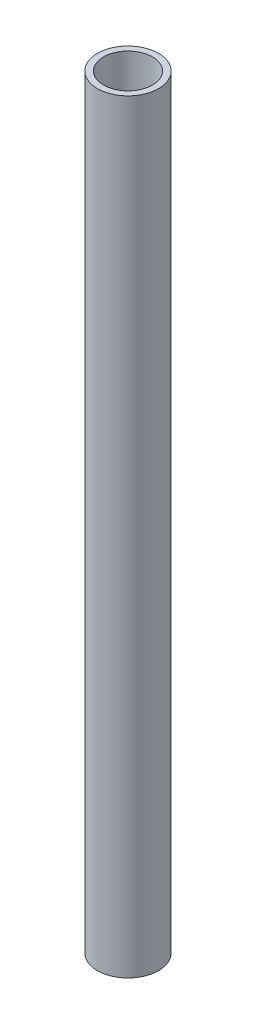
ISO-10303-21;
HEADER;
FILE_DESCRIPTION(('STEP AP214'),'2;1');
FILE_NAME('part.step','',(''),(''),'','','');
FILE_SCHEMA(('AUTOMOTIVE_DESIGN { 1 0 10303 214 1 1 1 1 }'));
ENDSEC;
DATA;
#1=APPLICATION_CONTEXT('core data for automotive mechanical design processes');
#2=APPLICATION_PROTOCOL_DEFINITION('international standard','automotive_design',2000,#1);
#3=PRODUCT_CONTEXT('',#1,'mechanical');
#4=PRODUCT('Part','Part','',(#3));
#5=PRODUCT_RELATED_PRODUCT_CATEGORY('part','',(#4));
#6=PRODUCT_DEFINITION_FORMATION('','',#4);
#7=PRODUCT_DEFINITION_CONTEXT('part definition',#1,'design');
#8=PRODUCT_DEFINITION('design','',#6,#7);
#9=PRODUCT_DEFINITION_SHAPE('','',#8);
#10=(LENGTH_UNIT() NAMED_UNIT(*) SI_UNIT(.MILLI.,.METRE.));
#11=(NAMED_UNIT(*) PLANE_ANGLE_UNIT() SI_UNIT($,.RADIAN.));
#12=(NAMED_UNIT(*) SI_UNIT($,.STERADIAN.) SOLID_ANGLE_UNIT());
#13=UNCERTAINTY_MEASURE_WITH_UNIT(LENGTH_MEASURE(1.E-05),#10,'distance_accuracy_value','');
#14=(GEOMETRIC_REPRESENTATION_CONTEXT(3) GLOBAL_UNCERTAINTY_ASSIGNED_CONTEXT((#13)) GLOBAL_UNIT_ASSIGNED_CONTEXT((#10,
#11,#12)) REPRESENTATION_CONTEXT('',''));
#15=CARTESIAN_POINT('',(0.,0.,0.));
#16=DIRECTION('',(0.,0.,1.));
#17=DIRECTION('',(1.,0.,0.));
#18=AXIS2_PLACEMENT_3D('',#15,#16,#17);
#19=CARTESIAN_POINT('',(0.,-100.,0.));
#20=DIRECTION('',(0.,1.,0.));
#21=DIRECTION('',(0.,0.,1.));
#22=AXIS2_PLACEMENT_3D('',#19,#20,#21);
#23=CYLINDRICAL_SURFACE('',#22,4.);
#24=CARTESIAN_POINT('',(0.,-100.,0.));
#25=DIRECTION('',(0.,1.,0.));
#26=DIRECTION('',(0.,0.,1.));
#27=AXIS2_PLACEMENT_3D('',#24,#25,#26);
#28=CIRCLE('',#27,4.);
#29=CARTESIAN_POINT('',(0.,-100.,4.));
#30=VERTEX_POINT('',#29);
#31=EDGE_CURVE('E10',#30,#30,#28,.T.);
#32=ORIENTED_EDGE('',*,*,#31,.T.);
#33=EDGE_LOOP('',(#32));
#34=FACE_BOUND('',#33,.T.);
#35=CARTESIAN_POINT('',(0.,0.,0.));
#36=DIRECTION('',(0.,1.,0.));
#37=DIRECTION('',(0.,0.,1.));
#38=AXIS2_PLACEMENT_3D('',#35,#36,#37);
#39=CIRCLE('',#38,4.);
#40=CARTESIAN_POINT('',(0.,0.,4.));
#41=VERTEX_POINT('',#40);
#42=EDGE_CURVE('E38',#41,#41,#39,.T.);
#43=ORIENTED_EDGE('',*,*,#42,.F.);
#44=EDGE_LOOP('',(#43));
#45=FACE_BOUND('',#44,.T.);
#46=ADVANCED_FACE('F35',(#34,#45),#23,.T.);
#47=CARTESIAN_POINT('',(0.,-100.,0.));
#48=DIRECTION('',(0.,1.,0.));
#49=DIRECTION('',(0.,0.,1.));
#50=AXIS2_PLACEMENT_3D('',#47,#48,#49);
#51=PLANE('',#50);
#52=CARTESIAN_POINT('',(0.,-100.,0.));
#53=DIRECTION('',(0.,1.,0.));
#54=DIRECTION('',(0.,0.,1.));
#55=AXIS2_PLACEMENT_3D('',#52,#53,#54);
#56=CIRCLE('',#55,3.2);
#57=CARTESIAN_POINT('',(0.,-100.,3.2));
#58=VERTEX_POINT('',#57);
#59=EDGE_CURVE('E45',#58,#58,#56,.T.);
#60=ORIENTED_EDGE('',*,*,#59,.T.);
#61=EDGE_LOOP('',(#60));
#62=FACE_BOUND('',#61,.T.);
#63=ORIENTED_EDGE('',*,*,#31,.F.);
#64=EDGE_LOOP('',(#63));
#65=FACE_BOUND('',#64,.T.);
#66=ADVANCED_FACE('F53',(#62,#65),#51,.F.);
#67=CARTESIAN_POINT('',(0.,0.,0.));
#68=DIRECTION('',(0.,1.,0.));
#69=DIRECTION('',(0.,0.,1.));
#70=AXIS2_PLACEMENT_3D('',#67,#68,#69);
#71=PLANE('',#70);
#72=CARTESIAN_POINT('',(0.,0.,0.));
#73=DIRECTION('',(0.,1.,0.));
#74=DIRECTION('',(0.,0.,1.));
#75=AXIS2_PLACEMENT_3D('',#72,#73,#74);
#76=CIRCLE('',#75,3.2);
#77=CARTESIAN_POINT('',(0.,0.,3.2));
#78=VERTEX_POINT('',#77);
#79=EDGE_CURVE('E47',#78,#78,#76,.T.);
#80=ORIENTED_EDGE('',*,*,#79,.F.);
#81=EDGE_LOOP('',(#80));
#82=FACE_BOUND('',#81,.T.);
#83=ORIENTED_EDGE('',*,*,#42,.T.);
#84=EDGE_LOOP('',(#83));
#85=FACE_BOUND('',#84,.T.);
#86=ADVANCED_FACE('F59',(#82,#85),#71,.T.);
#87=CARTESIAN_POINT('',(0.,-100.,0.));
#88=DIRECTION('',(0.,1.,0.));
#89=DIRECTION('',(0.,0.,1.));
#90=AXIS2_PLACEMENT_3D('',#87,#88,#89);
#91=CYLINDRICAL_SURFACE('',#90,3.2);
#92=ORIENTED_EDGE('',*,*,#59,.F.);
#93=EDGE_LOOP('',(#92));
#94=FACE_BOUND('',#93,.T.);
#95=ORIENTED_EDGE('',*,*,#79,.T.);
#96=EDGE_LOOP('',(#95));
#97=FACE_BOUND('',#96,.T.);
#98=ADVANCED_FACE('F56',(#94,#97),#91,.F.);
#99=CLOSED_SHELL('',(#46,#66,#86,#98));
#100=MANIFOLD_SOLID_BREP('B2',#99);
#101=ADVANCED_BREP_SHAPE_REPRESENTATION('',(#18,#100),#14);
#102=SHAPE_DEFINITION_REPRESENTATION(#9,#101);
ENDSEC;
END-ISO-10303-21;
